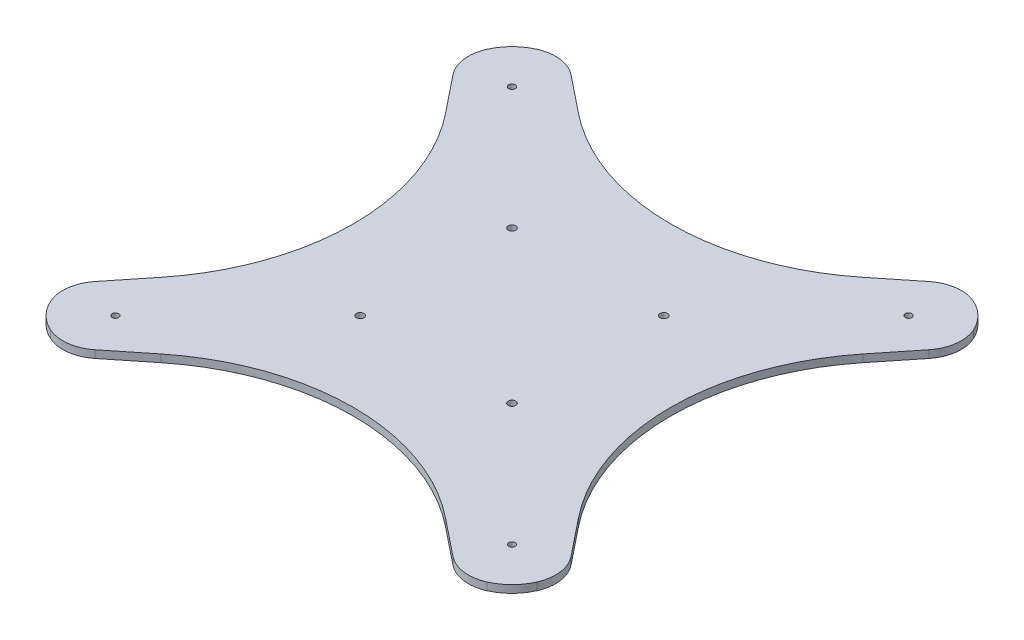
ISO-10303-21;
HEADER;
FILE_DESCRIPTION(('STEP AP214'),'2;1');
FILE_NAME('part.step','',(''),(''),'','','');
FILE_SCHEMA(('AUTOMOTIVE_DESIGN { 1 0 10303 214 1 1 1 1 }'));
ENDSEC;
DATA;
#1=APPLICATION_CONTEXT('core data for automotive mechanical design processes');
#2=APPLICATION_PROTOCOL_DEFINITION('international standard','automotive_design',2000,#1);
#3=PRODUCT_CONTEXT('',#1,'mechanical');
#4=PRODUCT('Part','Part','',(#3));
#5=PRODUCT_RELATED_PRODUCT_CATEGORY('part','',(#4));
#6=PRODUCT_DEFINITION_FORMATION('','',#4);
#7=PRODUCT_DEFINITION_CONTEXT('part definition',#1,'design');
#8=PRODUCT_DEFINITION('design','',#6,#7);
#9=PRODUCT_DEFINITION_SHAPE('','',#8);
#10=(LENGTH_UNIT() NAMED_UNIT(*) SI_UNIT(.MILLI.,.METRE.));
#11=(NAMED_UNIT(*) PLANE_ANGLE_UNIT() SI_UNIT($,.RADIAN.));
#12=(NAMED_UNIT(*) SI_UNIT($,.STERADIAN.) SOLID_ANGLE_UNIT());
#13=UNCERTAINTY_MEASURE_WITH_UNIT(LENGTH_MEASURE(1.E-05),#10,'distance_accuracy_value','');
#14=(GEOMETRIC_REPRESENTATION_CONTEXT(3) GLOBAL_UNCERTAINTY_ASSIGNED_CONTEXT((#13)) GLOBAL_UNIT_ASSIGNED_CONTEXT((#10,
#11,#12)) REPRESENTATION_CONTEXT('',''));
#15=CARTESIAN_POINT('',(0.,0.,0.));
#16=DIRECTION('',(0.,0.,1.));
#17=DIRECTION('',(1.,0.,0.));
#18=AXIS2_PLACEMENT_3D('',#15,#16,#17);
#19=CARTESIAN_POINT('',(109.89190371645,4.,106.880500832727));
#20=DIRECTION('',(0.,-1.,0.));
#21=DIRECTION('',(0.,0.,-1.));
#22=AXIS2_PLACEMENT_3D('',#19,#20,#21);
#23=CYLINDRICAL_SURFACE('',#22,20.);
#24=DIRECTION('',(0.,1.,0.));
#25=VECTOR('',#24,1.);
#26=CARTESIAN_POINT('',(125.50927990531,4.,94.386599881638));
#27=LINE('',#26,#25);
#28=CARTESIAN_POINT('',(125.50927990531,4.,94.3865998816379));
#29=VERTEX_POINT('',#28);
#30=CARTESIAN_POINT('',(125.50927990531,0.,94.3865998816379));
#31=VERTEX_POINT('',#30);
#32=EDGE_CURVE('E294',#29,#31,#27,.F.);
#33=ORIENTED_EDGE('',*,*,#32,.F.);
#34=CARTESIAN_POINT('',(109.89190371645,4.,106.880500832727));
#35=DIRECTION('',(0.,-1.,0.));
#36=DIRECTION('',(0.,0.,-1.));
#37=AXIS2_PLACEMENT_3D('',#34,#35,#36);
#38=CIRCLE('',#37,20.);
#39=CARTESIAN_POINT('',(128.188103990499,4.,114.958189582108));
#40=VERTEX_POINT('',#39);
#41=EDGE_CURVE('E42',#40,#29,#38,.F.);
#42=ORIENTED_EDGE('',*,*,#41,.F.);
#43=DIRECTION('',(0.,-1.,0.));
#44=VECTOR('',#43,1.);
#45=CARTESIAN_POINT('',(128.188103990499,4.,114.958189582108));
#46=LINE('',#45,#44);
#47=CARTESIAN_POINT('',(128.188103990499,0.,114.958189582108));
#48=VERTEX_POINT('',#47);
#49=EDGE_CURVE('E297',#48,#40,#46,.F.);
#50=ORIENTED_EDGE('',*,*,#49,.F.);
#51=CARTESIAN_POINT('',(109.89190371645,0.,106.880500832727));
#52=DIRECTION('',(0.,-1.,0.));
#53=DIRECTION('',(0.,0.,-1.));
#54=AXIS2_PLACEMENT_3D('',#51,#52,#53);
#55=CIRCLE('',#54,20.);
#56=EDGE_CURVE('E11',#31,#48,#55,.T.);
#57=ORIENTED_EDGE('',*,*,#56,.F.);
#58=EDGE_LOOP('',(#33,#42,#50,#57));
#59=FACE_BOUND('',#58,.T.);
#60=ADVANCED_FACE('F35',(#59),#23,.T.);
#61=CARTESIAN_POINT('',(106.880500832726,4.,109.89190371645));
#62=DIRECTION('',(0.,-1.,0.));
#63=DIRECTION('',(0.,0.,-1.));
#64=AXIS2_PLACEMENT_3D('',#61,#62,#63);
#65=CYLINDRICAL_SURFACE('',#64,20.);
#66=DIRECTION('',(0.,-1.,0.));
#67=VECTOR('',#66,1.);
#68=CARTESIAN_POINT('',(94.3865998816379,4.,125.509279905311));
#69=LINE('',#68,#67);
#70=CARTESIAN_POINT('',(94.3865998816379,0.,125.509279905311));
#71=VERTEX_POINT('',#70);
#72=CARTESIAN_POINT('',(94.3865998816379,4.,125.509279905311));
#73=VERTEX_POINT('',#72);
#74=EDGE_CURVE('E284',#71,#73,#69,.F.);
#75=ORIENTED_EDGE('',*,*,#74,.F.);
#76=CARTESIAN_POINT('',(106.880500832726,0.,109.89190371645));
#77=DIRECTION('',(0.,-1.,0.));
#78=DIRECTION('',(0.,0.,-1.));
#79=AXIS2_PLACEMENT_3D('',#76,#77,#78);
#80=CIRCLE('',#79,20.);
#81=CARTESIAN_POINT('',(114.958189582106,0.,128.1881039905));
#82=VERTEX_POINT('',#81);
#83=EDGE_CURVE('E290',#82,#71,#80,.T.);
#84=ORIENTED_EDGE('',*,*,#83,.F.);
#85=DIRECTION('',(0.,-1.,0.));
#86=VECTOR('',#85,1.);
#87=CARTESIAN_POINT('',(114.958189582106,4.,128.1881039905));
#88=LINE('',#87,#86);
#89=CARTESIAN_POINT('',(114.958189582106,4.,128.1881039905));
#90=VERTEX_POINT('',#89);
#91=EDGE_CURVE('E287',#90,#82,#88,.T.);
#92=ORIENTED_EDGE('',*,*,#91,.F.);
#93=CARTESIAN_POINT('',(106.880500832726,4.,109.89190371645));
#94=DIRECTION('',(0.,-1.,0.));
#95=DIRECTION('',(0.,0.,-1.));
#96=AXIS2_PLACEMENT_3D('',#93,#94,#95);
#97=CIRCLE('',#96,20.);
#98=EDGE_CURVE('E292',#73,#90,#97,.F.);
#99=ORIENTED_EDGE('',*,*,#98,.F.);
#100=EDGE_LOOP('',(#75,#84,#92,#99));
#101=FACE_BOUND('',#100,.T.);
#102=ADVANCED_FACE('F556',(#101),#65,.T.);
#103=CARTESIAN_POINT('',(-109.89190371645,4.,106.880500832727));
#104=DIRECTION('',(0.,-1.,0.));
#105=DIRECTION('',(0.,0.,-1.));
#106=AXIS2_PLACEMENT_3D('',#103,#104,#105);
#107=CYLINDRICAL_SURFACE('',#106,20.);
#108=DIRECTION('',(0.,-1.,0.));
#109=VECTOR('',#108,1.);
#110=CARTESIAN_POINT('',(-125.50927990531,4.,94.3865998816381));
#111=LINE('',#110,#109);
#112=CARTESIAN_POINT('',(-125.50927990531,0.,94.3865998816382));
#113=VERTEX_POINT('',#112);
#114=CARTESIAN_POINT('',(-125.50927990531,4.,94.3865998816382));
#115=VERTEX_POINT('',#114);
#116=EDGE_CURVE('E274',#113,#115,#111,.F.);
#117=ORIENTED_EDGE('',*,*,#116,.F.);
#118=CARTESIAN_POINT('',(-109.89190371645,0.,106.880500832727));
#119=DIRECTION('',(0.,-1.,0.));
#120=DIRECTION('',(0.,0.,-1.));
#121=AXIS2_PLACEMENT_3D('',#118,#119,#120);
#122=CIRCLE('',#121,20.);
#123=CARTESIAN_POINT('',(-128.188103990499,0.,114.958189582107));
#124=VERTEX_POINT('',#123);
#125=EDGE_CURVE('E280',#124,#113,#122,.T.);
#126=ORIENTED_EDGE('',*,*,#125,.F.);
#127=DIRECTION('',(0.,-1.,0.));
#128=VECTOR('',#127,1.);
#129=CARTESIAN_POINT('',(-128.188103990499,4.,114.958189582107));
#130=LINE('',#129,#128);
#131=CARTESIAN_POINT('',(-128.188103990499,4.,114.958189582107));
#132=VERTEX_POINT('',#131);
#133=EDGE_CURVE('E277',#132,#124,#130,.T.);
#134=ORIENTED_EDGE('',*,*,#133,.F.);
#135=CARTESIAN_POINT('',(-109.89190371645,4.,106.880500832727));
#136=DIRECTION('',(0.,-1.,0.));
#137=DIRECTION('',(0.,0.,-1.));
#138=AXIS2_PLACEMENT_3D('',#135,#136,#137);
#139=CIRCLE('',#138,20.);
#140=EDGE_CURVE('E282',#115,#132,#139,.F.);
#141=ORIENTED_EDGE('',*,*,#140,.F.);
#142=EDGE_LOOP('',(#117,#126,#134,#141));
#143=FACE_BOUND('',#142,.T.);
#144=ADVANCED_FACE('F455',(#143),#107,.T.);
#145=CARTESIAN_POINT('',(-106.880500832726,4.,109.89190371645));
#146=DIRECTION('',(0.,-1.,0.));
#147=DIRECTION('',(0.,0.,-1.));
#148=AXIS2_PLACEMENT_3D('',#145,#146,#147);
#149=CYLINDRICAL_SURFACE('',#148,20.);
#150=DIRECTION('',(0.,-1.,0.));
#151=VECTOR('',#150,1.);
#152=CARTESIAN_POINT('',(-94.3865998816377,4.,125.50927990531));
#153=LINE('',#152,#151);
#154=CARTESIAN_POINT('',(-94.3865998816377,4.,125.50927990531));
#155=VERTEX_POINT('',#154);
#156=CARTESIAN_POINT('',(-94.3865998816377,0.,125.50927990531));
#157=VERTEX_POINT('',#156);
#158=EDGE_CURVE('E265',#155,#157,#153,.T.);
#159=ORIENTED_EDGE('',*,*,#158,.F.);
#160=CARTESIAN_POINT('',(-106.880500832726,4.,109.89190371645));
#161=DIRECTION('',(0.,-1.,0.));
#162=DIRECTION('',(0.,0.,-1.));
#163=AXIS2_PLACEMENT_3D('',#160,#161,#162);
#164=CIRCLE('',#163,20.);
#165=CARTESIAN_POINT('',(-114.958189582106,4.,128.1881039905));
#166=VERTEX_POINT('',#165);
#167=EDGE_CURVE('E200',#166,#155,#164,.F.);
#168=ORIENTED_EDGE('',*,*,#167,.F.);
#169=DIRECTION('',(0.,-1.,0.));
#170=VECTOR('',#169,1.);
#171=CARTESIAN_POINT('',(-114.958189582106,4.,128.1881039905));
#172=LINE('',#171,#170);
#173=CARTESIAN_POINT('',(-114.958189582106,0.,128.1881039905));
#174=VERTEX_POINT('',#173);
#175=EDGE_CURVE('E267',#174,#166,#172,.F.);
#176=ORIENTED_EDGE('',*,*,#175,.F.);
#177=CARTESIAN_POINT('',(-106.880500832726,0.,109.89190371645));
#178=DIRECTION('',(0.,-1.,0.));
#179=DIRECTION('',(0.,0.,-1.));
#180=AXIS2_PLACEMENT_3D('',#177,#178,#179);
#181=CIRCLE('',#180,20.);
#182=EDGE_CURVE('E271',#157,#174,#181,.T.);
#183=ORIENTED_EDGE('',*,*,#182,.F.);
#184=EDGE_LOOP('',(#159,#168,#176,#183));
#185=FACE_BOUND('',#184,.T.);
#186=ADVANCED_FACE('F461',(#185),#149,.T.);
#187=CARTESIAN_POINT('',(-109.89190371645,4.,-106.880500832726));
#188=DIRECTION('',(0.,-1.,0.));
#189=DIRECTION('',(0.,0.,-1.));
#190=AXIS2_PLACEMENT_3D('',#187,#188,#189);
#191=CYLINDRICAL_SURFACE('',#190,20.);
#192=DIRECTION('',(0.,-1.,0.));
#193=VECTOR('',#192,1.);
#194=CARTESIAN_POINT('',(-125.50927990531,4.,-94.3865998816378));
#195=LINE('',#194,#193);
#196=CARTESIAN_POINT('',(-125.50927990531,4.,-94.3865998816378));
#197=VERTEX_POINT('',#196);
#198=CARTESIAN_POINT('',(-125.50927990531,0.,-94.3865998816378));
#199=VERTEX_POINT('',#198);
#200=EDGE_CURVE('E255',#197,#199,#195,.T.);
#201=ORIENTED_EDGE('',*,*,#200,.F.);
#202=CARTESIAN_POINT('',(-109.89190371645,4.,-106.880500832726));
#203=DIRECTION('',(0.,-1.,0.));
#204=DIRECTION('',(0.,0.,-1.));
#205=AXIS2_PLACEMENT_3D('',#202,#203,#204);
#206=CIRCLE('',#205,20.);
#207=CARTESIAN_POINT('',(-128.1881039905,4.,-114.958189582106));
#208=VERTEX_POINT('',#207);
#209=EDGE_CURVE('E261',#208,#197,#206,.F.);
#210=ORIENTED_EDGE('',*,*,#209,.F.);
#211=DIRECTION('',(0.,-1.,0.));
#212=VECTOR('',#211,1.);
#213=CARTESIAN_POINT('',(-128.1881039905,4.,-114.958189582106));
#214=LINE('',#213,#212);
#215=CARTESIAN_POINT('',(-128.1881039905,0.,-114.958189582106));
#216=VERTEX_POINT('',#215);
#217=EDGE_CURVE('E258',#216,#208,#214,.F.);
#218=ORIENTED_EDGE('',*,*,#217,.F.);
#219=CARTESIAN_POINT('',(-109.89190371645,0.,-106.880500832726));
#220=DIRECTION('',(0.,-1.,0.));
#221=DIRECTION('',(0.,0.,-1.));
#222=AXIS2_PLACEMENT_3D('',#219,#220,#221);
#223=CIRCLE('',#222,20.);
#224=EDGE_CURVE('E263',#199,#216,#223,.T.);
#225=ORIENTED_EDGE('',*,*,#224,.F.);
#226=EDGE_LOOP('',(#201,#210,#218,#225));
#227=FACE_BOUND('',#226,.T.);
#228=ADVANCED_FACE('F436',(#227),#191,.T.);
#229=CARTESIAN_POINT('',(-106.880500832726,4.,-109.89190371645));
#230=DIRECTION('',(0.,-1.,0.));
#231=DIRECTION('',(0.,0.,-1.));
#232=AXIS2_PLACEMENT_3D('',#229,#230,#231);
#233=CYLINDRICAL_SURFACE('',#232,20.);
#234=DIRECTION('',(0.,1.,0.));
#235=VECTOR('',#234,1.);
#236=CARTESIAN_POINT('',(-94.3865998816378,4.,-125.50927990531));
#237=LINE('',#236,#235);
#238=CARTESIAN_POINT('',(-94.3865998816378,0.,-125.50927990531));
#239=VERTEX_POINT('',#238);
#240=CARTESIAN_POINT('',(-94.3865998816378,4.,-125.50927990531));
#241=VERTEX_POINT('',#240);
#242=EDGE_CURVE('E245',#239,#241,#237,.T.);
#243=ORIENTED_EDGE('',*,*,#242,.F.);
#244=CARTESIAN_POINT('',(-106.880500832726,0.,-109.89190371645));
#245=DIRECTION('',(0.,-1.,0.));
#246=DIRECTION('',(0.,0.,-1.));
#247=AXIS2_PLACEMENT_3D('',#244,#245,#246);
#248=CIRCLE('',#247,20.);
#249=CARTESIAN_POINT('',(-114.958189582106,0.,-128.1881039905));
#250=VERTEX_POINT('',#249);
#251=EDGE_CURVE('E251',#250,#239,#248,.T.);
#252=ORIENTED_EDGE('',*,*,#251,.F.);
#253=DIRECTION('',(0.,-1.,0.));
#254=VECTOR('',#253,1.);
#255=CARTESIAN_POINT('',(-114.958189582106,4.,-128.1881039905));
#256=LINE('',#255,#254);
#257=CARTESIAN_POINT('',(-114.958189582106,4.,-128.1881039905));
#258=VERTEX_POINT('',#257);
#259=EDGE_CURVE('E248',#258,#250,#256,.T.);
#260=ORIENTED_EDGE('',*,*,#259,.F.);
#261=CARTESIAN_POINT('',(-106.880500832726,4.,-109.89190371645));
#262=DIRECTION('',(0.,-1.,0.));
#263=DIRECTION('',(0.,0.,-1.));
#264=AXIS2_PLACEMENT_3D('',#261,#262,#263);
#265=CIRCLE('',#264,20.);
#266=EDGE_CURVE('E253',#241,#258,#265,.F.);
#267=ORIENTED_EDGE('',*,*,#266,.F.);
#268=EDGE_LOOP('',(#243,#252,#260,#267));
#269=FACE_BOUND('',#268,.T.);
#270=ADVANCED_FACE('F429',(#269),#233,.T.);
#271=CARTESIAN_POINT('',(106.880500832726,4.,-109.89190371645));
#272=DIRECTION('',(0.,-1.,0.));
#273=DIRECTION('',(0.,0.,-1.));
#274=AXIS2_PLACEMENT_3D('',#271,#272,#273);
#275=CYLINDRICAL_SURFACE('',#274,20.);
#276=DIRECTION('',(0.,1.,0.));
#277=VECTOR('',#276,1.);
#278=CARTESIAN_POINT('',(94.3865998816378,4.,-125.50927990531));
#279=LINE('',#278,#277);
#280=CARTESIAN_POINT('',(94.3865998816378,4.,-125.50927990531));
#281=VERTEX_POINT('',#280);
#282=CARTESIAN_POINT('',(94.3865998816378,0.,-125.50927990531));
#283=VERTEX_POINT('',#282);
#284=EDGE_CURVE('E235',#281,#283,#279,.F.);
#285=ORIENTED_EDGE('',*,*,#284,.F.);
#286=CARTESIAN_POINT('',(106.880500832726,4.,-109.89190371645));
#287=DIRECTION('',(0.,-1.,0.));
#288=DIRECTION('',(0.,0.,-1.));
#289=AXIS2_PLACEMENT_3D('',#286,#287,#288);
#290=CIRCLE('',#289,20.);
#291=CARTESIAN_POINT('',(114.958189582106,4.,-128.1881039905));
#292=VERTEX_POINT('',#291);
#293=EDGE_CURVE('E241',#292,#281,#290,.F.);
#294=ORIENTED_EDGE('',*,*,#293,.F.);
#295=DIRECTION('',(0.,-1.,0.));
#296=VECTOR('',#295,1.);
#297=CARTESIAN_POINT('',(114.958189582106,4.,-128.1881039905));
#298=LINE('',#297,#296);
#299=CARTESIAN_POINT('',(114.958189582106,0.,-128.1881039905));
#300=VERTEX_POINT('',#299);
#301=EDGE_CURVE('E238',#300,#292,#298,.F.);
#302=ORIENTED_EDGE('',*,*,#301,.F.);
#303=CARTESIAN_POINT('',(106.880500832726,0.,-109.89190371645));
#304=DIRECTION('',(0.,-1.,0.));
#305=DIRECTION('',(0.,0.,-1.));
#306=AXIS2_PLACEMENT_3D('',#303,#304,#305);
#307=CIRCLE('',#306,20.);
#308=EDGE_CURVE('E243',#283,#300,#307,.T.);
#309=ORIENTED_EDGE('',*,*,#308,.F.);
#310=EDGE_LOOP('',(#285,#294,#302,#309));
#311=FACE_BOUND('',#310,.T.);
#312=ADVANCED_FACE('F411',(#311),#275,.T.);
#313=CARTESIAN_POINT('',(109.89190371645,4.,-106.880500832726));
#314=DIRECTION('',(0.,-1.,0.));
#315=DIRECTION('',(0.,0.,-1.));
#316=AXIS2_PLACEMENT_3D('',#313,#314,#315);
#317=CYLINDRICAL_SURFACE('',#316,20.);
#318=DIRECTION('',(0.,1.,0.));
#319=VECTOR('',#318,1.);
#320=CARTESIAN_POINT('',(125.50927990531,4.,-94.3865998816377));
#321=LINE('',#320,#319);
#322=CARTESIAN_POINT('',(125.50927990531,0.,-94.3865998816378));
#323=VERTEX_POINT('',#322);
#324=CARTESIAN_POINT('',(125.50927990531,4.,-94.3865998816378));
#325=VERTEX_POINT('',#324);
#326=EDGE_CURVE('E220',#323,#325,#321,.T.);
#327=ORIENTED_EDGE('',*,*,#326,.F.);
#328=CARTESIAN_POINT('',(109.89190371645,0.,-106.880500832726));
#329=DIRECTION('',(0.,-1.,0.));
#330=DIRECTION('',(0.,0.,-1.));
#331=AXIS2_PLACEMENT_3D('',#328,#329,#330);
#332=CIRCLE('',#331,20.);
#333=CARTESIAN_POINT('',(128.1881039905,0.,-114.958189582106));
#334=VERTEX_POINT('',#333);
#335=EDGE_CURVE('E231',#334,#323,#332,.T.);
#336=ORIENTED_EDGE('',*,*,#335,.F.);
#337=DIRECTION('',(0.,-1.,0.));
#338=VECTOR('',#337,1.);
#339=CARTESIAN_POINT('',(128.1881039905,4.,-114.958189582106));
#340=LINE('',#339,#338);
#341=CARTESIAN_POINT('',(128.1881039905,4.,-114.958189582106));
#342=VERTEX_POINT('',#341);
#343=EDGE_CURVE('E223',#342,#334,#340,.T.);
#344=ORIENTED_EDGE('',*,*,#343,.F.);
#345=CARTESIAN_POINT('',(109.89190371645,4.,-106.880500832726));
#346=DIRECTION('',(0.,-1.,0.));
#347=DIRECTION('',(0.,0.,-1.));
#348=AXIS2_PLACEMENT_3D('',#345,#346,#347);
#349=CIRCLE('',#348,20.);
#350=EDGE_CURVE('E233',#325,#342,#349,.F.);
#351=ORIENTED_EDGE('',*,*,#350,.F.);
#352=EDGE_LOOP('',(#327,#336,#344,#351));
#353=FACE_BOUND('',#352,.T.);
#354=ADVANCED_FACE('F405',(#353),#317,.T.);
#355=CARTESIAN_POINT('',(-99.9999999999998,4.,130.));
#356=DIRECTION('',(-0.624695047554429,0.,-0.780868809443027));
#357=DIRECTION('',(-0.780868809443027,0.,0.624695047554429));
#358=AXIS2_PLACEMENT_3D('',#355,#356,#357);
#359=PLANE('',#358);
#360=DIRECTION('',(0.780868809443027,0.,-0.624695047554429));
#361=VECTOR('',#360,1.);
#362=CARTESIAN_POINT('',(-99.9999999999998,4.,130.));
#363=LINE('',#362,#361);
#364=CARTESIAN_POINT('',(-74.9634057065314,4.,109.970724565225));
#365=VERTEX_POINT('',#364);
#366=EDGE_CURVE('E192',#155,#365,#363,.T.);
#367=ORIENTED_EDGE('',*,*,#366,.F.);
#368=ORIENTED_EDGE('',*,*,#158,.T.);
#369=DIRECTION('',(0.780868809443027,0.,-0.624695047554429));
#370=VECTOR('',#369,1.);
#371=CARTESIAN_POINT('',(-99.9999999999998,0.,130.));
#372=LINE('',#371,#370);
#373=CARTESIAN_POINT('',(-74.9634057065314,0.,109.970724565225));
#374=VERTEX_POINT('',#373);
#375=EDGE_CURVE('E218',#157,#374,#372,.T.);
#376=ORIENTED_EDGE('',*,*,#375,.T.);
#377=DIRECTION('',(0.,-1.,0.));
#378=VECTOR('',#377,1.);
#379=CARTESIAN_POINT('',(-74.9634057065314,4.,109.970724565225));
#380=LINE('',#379,#378);
#381=EDGE_CURVE('E210',#365,#374,#380,.T.);
#382=ORIENTED_EDGE('',*,*,#381,.F.);
#383=EDGE_LOOP('',(#367,#368,#376,#382));
#384=FACE_BOUND('',#383,.T.);
#385=ADVANCED_FACE('F216',(#384),#359,.F.);
#386=CARTESIAN_POINT('',(0.,4.,203.674981698388));
#387=DIRECTION('',(0.,-1.,0.));
#388=DIRECTION('',(0.,0.,-1.));
#389=AXIS2_PLACEMENT_3D('',#386,#387,#388);
#390=CYLINDRICAL_SURFACE('',#389,120.);
#391=CARTESIAN_POINT('',(0.,0.,203.674981698388));
#392=DIRECTION('',(0.,-1.,0.));
#393=DIRECTION('',(0.,0.,-1.));
#394=AXIS2_PLACEMENT_3D('',#391,#392,#393);
#395=CIRCLE('',#394,120.);
#396=CARTESIAN_POINT('',(74.9634057065294,0.,109.970724565224));
#397=VERTEX_POINT('',#396);
#398=EDGE_CURVE('E341',#374,#397,#395,.T.);
#399=ORIENTED_EDGE('',*,*,#398,.T.);
#400=DIRECTION('',(0.,-1.,0.));
#401=VECTOR('',#400,1.);
#402=CARTESIAN_POINT('',(74.9634057065294,4.,109.970724565224));
#403=LINE('',#402,#401);
#404=CARTESIAN_POINT('',(74.9634057065294,4.,109.970724565224));
#405=VERTEX_POINT('',#404);
#406=EDGE_CURVE('E212',#405,#397,#403,.T.);
#407=ORIENTED_EDGE('',*,*,#406,.F.);
#408=CARTESIAN_POINT('',(0.,4.,203.674981698388));
#409=DIRECTION('',(0.,-1.,0.));
#410=DIRECTION('',(0.,0.,-1.));
#411=AXIS2_PLACEMENT_3D('',#408,#409,#410);
#412=CIRCLE('',#411,120.);
#413=EDGE_CURVE('E197',#365,#405,#412,.T.);
#414=ORIENTED_EDGE('',*,*,#413,.F.);
#415=ORIENTED_EDGE('',*,*,#381,.T.);
#416=EDGE_LOOP('',(#399,#407,#414,#415));
#417=FACE_BOUND('',#416,.T.);
#418=ADVANCED_FACE('F209',(#417),#390,.F.);
#419=CARTESIAN_POINT('',(74.9634057065294,4.,109.970724565224));
#420=DIRECTION('',(0.624695047554432,0.,-0.780868809443024));
#421=DIRECTION('',(-0.780868809443024,0.,-0.624695047554432));
#422=AXIS2_PLACEMENT_3D('',#419,#420,#421);
#423=PLANE('',#422);
#424=DIRECTION('',(0.780868809443024,0.,0.624695047554432));
#425=VECTOR('',#424,1.);
#426=CARTESIAN_POINT('',(74.9634057065294,0.,109.970724565224));
#427=LINE('',#426,#425);
#428=EDGE_CURVE('E344',#397,#71,#427,.T.);
#429=ORIENTED_EDGE('',*,*,#428,.T.);
#430=ORIENTED_EDGE('',*,*,#74,.T.);
#431=DIRECTION('',(0.780868809443024,0.,0.624695047554432));
#432=VECTOR('',#431,1.);
#433=CARTESIAN_POINT('',(74.9634057065294,4.,109.970724565224));
#434=LINE('',#433,#432);
#435=EDGE_CURVE('E214',#405,#73,#434,.T.);
#436=ORIENTED_EDGE('',*,*,#435,.F.);
#437=ORIENTED_EDGE('',*,*,#406,.T.);
#438=EDGE_LOOP('',(#429,#430,#436,#437));
#439=FACE_BOUND('',#438,.T.);
#440=ADVANCED_FACE('F464',(#439),#423,.F.);
#441=CARTESIAN_POINT('',(104.5,4.,104.5));
#442=DIRECTION('',(0.,-1.,0.));
#443=DIRECTION('',(0.,0.,-1.));
#444=AXIS2_PLACEMENT_3D('',#441,#442,#443);
#445=CYLINDRICAL_SURFACE('',#444,25.8940147524486);
#446=CARTESIAN_POINT('',(104.5,0.,104.5));
#447=DIRECTION('',(0.,1.,0.));
#448=DIRECTION('',(0.,0.,1.));
#449=AXIS2_PLACEMENT_3D('',#446,#447,#448);
#450=CIRCLE('',#449,25.8940147524486);
#451=EDGE_CURVE('E347',#82,#48,#450,.T.);
#452=ORIENTED_EDGE('',*,*,#451,.T.);
#453=ORIENTED_EDGE('',*,*,#49,.T.);
#454=CARTESIAN_POINT('',(104.5,4.,104.5));
#455=DIRECTION('',(0.,1.,0.));
#456=DIRECTION('',(0.,0.,1.));
#457=AXIS2_PLACEMENT_3D('',#454,#455,#456);
#458=CIRCLE('',#457,25.8940147524486);
#459=EDGE_CURVE('E304',#90,#40,#458,.T.);
#460=ORIENTED_EDGE('',*,*,#459,.F.);
#461=ORIENTED_EDGE('',*,*,#91,.T.);
#462=EDGE_LOOP('',(#452,#453,#460,#461));
#463=FACE_BOUND('',#462,.T.);
#464=ADVANCED_FACE('F582',(#463),#445,.T.);
#465=CARTESIAN_POINT('',(109.970724565227,4.,74.9634057065347));
#466=DIRECTION('',(0.780868809443008,0.,-0.624695047554452));
#467=DIRECTION('',(-0.624695047554452,0.,-0.780868809443008));
#468=AXIS2_PLACEMENT_3D('',#465,#466,#467);
#469=PLANE('',#468);
#470=DIRECTION('',(0.624695047554452,0.,0.780868809443008));
#471=VECTOR('',#470,1.);
#472=CARTESIAN_POINT('',(109.970724565227,4.,74.9634057065347));
#473=LINE('',#472,#471);
#474=CARTESIAN_POINT('',(109.970724565227,4.,74.9634057065347));
#475=VERTEX_POINT('',#474);
#476=EDGE_CURVE('E301',#475,#29,#473,.T.);
#477=ORIENTED_EDGE('',*,*,#476,.T.);
#478=ORIENTED_EDGE('',*,*,#32,.T.);
#479=DIRECTION('',(0.624695047554452,0.,0.780868809443008));
#480=VECTOR('',#479,1.);
#481=CARTESIAN_POINT('',(109.970724565227,0.,74.9634057065347));
#482=LINE('',#481,#480);
#483=CARTESIAN_POINT('',(109.970724565227,0.,74.9634057065347));
#484=VERTEX_POINT('',#483);
#485=EDGE_CURVE('E350',#484,#31,#482,.T.);
#486=ORIENTED_EDGE('',*,*,#485,.F.);
#487=DIRECTION('',(0.,-1.,0.));
#488=VECTOR('',#487,1.);
#489=CARTESIAN_POINT('',(109.970724565227,4.,74.9634057065347));
#490=LINE('',#489,#488);
#491=EDGE_CURVE('E225',#475,#484,#490,.T.);
#492=ORIENTED_EDGE('',*,*,#491,.F.);
#493=EDGE_LOOP('',(#477,#478,#486,#492));
#494=FACE_BOUND('',#493,.T.);
#495=ADVANCED_FACE('F307',(#494),#469,.T.);
#496=CARTESIAN_POINT('',(203.674981698388,4.,0.));
#497=DIRECTION('',(0.,-1.,0.));
#498=DIRECTION('',(0.,0.,-1.));
#499=AXIS2_PLACEMENT_3D('',#496,#497,#498);
#500=CYLINDRICAL_SURFACE('',#499,120.000000000001);
#501=CARTESIAN_POINT('',(203.674981698388,0.,0.));
#502=DIRECTION('',(0.,1.,0.));
#503=DIRECTION('',(0.,0.,1.));
#504=AXIS2_PLACEMENT_3D('',#501,#502,#503);
#505=CIRCLE('',#504,120.000000000001);
#506=CARTESIAN_POINT('',(109.970724565224,0.,-74.9634057065315));
#507=VERTEX_POINT('',#506);
#508=EDGE_CURVE('E352',#507,#484,#505,.T.);
#509=ORIENTED_EDGE('',*,*,#508,.F.);
#510=DIRECTION('',(0.,-1.,0.));
#511=VECTOR('',#510,1.);
#512=CARTESIAN_POINT('',(109.970724565224,4.,-74.9634057065315));
#513=LINE('',#512,#511);
#514=CARTESIAN_POINT('',(109.970724565224,4.,-74.9634057065315));
#515=VERTEX_POINT('',#514);
#516=EDGE_CURVE('E389',#515,#507,#513,.T.);
#517=ORIENTED_EDGE('',*,*,#516,.F.);
#518=CARTESIAN_POINT('',(203.674981698388,4.,0.));
#519=DIRECTION('',(0.,1.,0.));
#520=DIRECTION('',(0.,0.,1.));
#521=AXIS2_PLACEMENT_3D('',#518,#519,#520);
#522=CIRCLE('',#521,120.000000000001);
#523=EDGE_CURVE('E308',#515,#475,#522,.T.);
#524=ORIENTED_EDGE('',*,*,#523,.T.);
#525=ORIENTED_EDGE('',*,*,#491,.T.);
#526=EDGE_LOOP('',(#509,#517,#524,#525));
#527=FACE_BOUND('',#526,.T.);
#528=ADVANCED_FACE('F393',(#527),#500,.F.);
#529=CARTESIAN_POINT('',(130.,4.,-99.9999999999998));
#530=DIRECTION('',(0.780868809443024,0.,0.624695047554432));
#531=DIRECTION('',(0.624695047554432,0.,-0.780868809443024));
#532=AXIS2_PLACEMENT_3D('',#529,#530,#531);
#533=PLANE('',#532);
#534=DIRECTION('',(-0.624695047554432,0.,0.780868809443024));
#535=VECTOR('',#534,1.);
#536=CARTESIAN_POINT('',(130.,0.,-99.9999999999998));
#537=LINE('',#536,#535);
#538=EDGE_CURVE('E355',#323,#507,#537,.T.);
#539=ORIENTED_EDGE('',*,*,#538,.F.);
#540=ORIENTED_EDGE('',*,*,#326,.T.);
#541=DIRECTION('',(-0.624695047554432,0.,0.780868809443024));
#542=VECTOR('',#541,1.);
#543=CARTESIAN_POINT('',(130.,4.,-99.9999999999998));
#544=LINE('',#543,#542);
#545=EDGE_CURVE('E310',#325,#515,#544,.T.);
#546=ORIENTED_EDGE('',*,*,#545,.T.);
#547=ORIENTED_EDGE('',*,*,#516,.T.);
#548=EDGE_LOOP('',(#539,#540,#546,#547));
#549=FACE_BOUND('',#548,.T.);
#550=ADVANCED_FACE('F400',(#549),#533,.T.);
#551=CARTESIAN_POINT('',(104.5,4.,-104.5));
#552=DIRECTION('',(0.,-1.,0.));
#553=DIRECTION('',(0.,0.,-1.));
#554=AXIS2_PLACEMENT_3D('',#551,#552,#553);
#555=CYLINDRICAL_SURFACE('',#554,25.8940147524482);
#556=CARTESIAN_POINT('',(104.5,0.,-104.5));
#557=DIRECTION('',(0.,1.,0.));
#558=DIRECTION('',(0.,0.,1.));
#559=AXIS2_PLACEMENT_3D('',#556,#557,#558);
#560=CIRCLE('',#559,25.8940147524482);
#561=EDGE_CURVE('E357',#334,#300,#560,.T.);
#562=ORIENTED_EDGE('',*,*,#561,.T.);
#563=ORIENTED_EDGE('',*,*,#301,.T.);
#564=CARTESIAN_POINT('',(104.5,4.,-104.5));
#565=DIRECTION('',(0.,1.,0.));
#566=DIRECTION('',(0.,0.,1.));
#567=AXIS2_PLACEMENT_3D('',#564,#565,#566);
#568=CIRCLE('',#567,25.8940147524482);
#569=EDGE_CURVE('E316',#342,#292,#568,.T.);
#570=ORIENTED_EDGE('',*,*,#569,.F.);
#571=ORIENTED_EDGE('',*,*,#343,.T.);
#572=EDGE_LOOP('',(#562,#563,#570,#571));
#573=FACE_BOUND('',#572,.T.);
#574=ADVANCED_FACE('F407',(#573),#555,.T.);
#575=CARTESIAN_POINT('',(74.9634057065315,4.,-109.970724565225));
#576=DIRECTION('',(-0.624695047554425,0.,-0.78086880944303));
#577=DIRECTION('',(-0.78086880944303,0.,0.624695047554425));
#578=AXIS2_PLACEMENT_3D('',#575,#576,#577);
#579=PLANE('',#578);
#580=DIRECTION('',(0.78086880944303,0.,-0.624695047554425));
#581=VECTOR('',#580,1.);
#582=CARTESIAN_POINT('',(74.9634057065315,4.,-109.970724565225));
#583=LINE('',#582,#581);
#584=CARTESIAN_POINT('',(74.9634057065315,4.,-109.970724565225));
#585=VERTEX_POINT('',#584);
#586=EDGE_CURVE('E319',#585,#281,#583,.T.);
#587=ORIENTED_EDGE('',*,*,#586,.T.);
#588=ORIENTED_EDGE('',*,*,#284,.T.);
#589=DIRECTION('',(0.78086880944303,0.,-0.624695047554425));
#590=VECTOR('',#589,1.);
#591=CARTESIAN_POINT('',(74.9634057065315,0.,-109.970724565225));
#592=LINE('',#591,#590);
#593=CARTESIAN_POINT('',(74.9634057065315,0.,-109.970724565225));
#594=VERTEX_POINT('',#593);
#595=EDGE_CURVE('E360',#594,#283,#592,.T.);
#596=ORIENTED_EDGE('',*,*,#595,.F.);
#597=DIRECTION('',(0.,-1.,0.));
#598=VECTOR('',#597,1.);
#599=CARTESIAN_POINT('',(74.9634057065315,4.,-109.970724565225));
#600=LINE('',#599,#598);
#601=EDGE_CURVE('E387',#585,#594,#600,.T.);
#602=ORIENTED_EDGE('',*,*,#601,.F.);
#603=EDGE_LOOP('',(#587,#588,#596,#602));
#604=FACE_BOUND('',#603,.T.);
#605=ADVANCED_FACE('F417',(#604),#579,.T.);
#606=CARTESIAN_POINT('',(0.,4.,-203.674981698388));
#607=DIRECTION('',(0.,-1.,0.));
#608=DIRECTION('',(0.,0.,-1.));
#609=AXIS2_PLACEMENT_3D('',#606,#607,#608);
#610=CYLINDRICAL_SURFACE('',#609,120.);
#611=CARTESIAN_POINT('',(0.,0.,-203.674981698388));
#612=DIRECTION('',(0.,-1.,0.));
#613=DIRECTION('',(0.,0.,-1.));
#614=AXIS2_PLACEMENT_3D('',#611,#612,#613);
#615=CIRCLE('',#614,120.);
#616=CARTESIAN_POINT('',(-74.9634057065315,0.,-109.970724565225));
#617=VERTEX_POINT('',#616);
#618=EDGE_CURVE('E363',#594,#617,#615,.T.);
#619=ORIENTED_EDGE('',*,*,#618,.T.);
#620=DIRECTION('',(0.,-1.,0.));
#621=VECTOR('',#620,1.);
#622=CARTESIAN_POINT('',(-74.9634057065315,4.,-109.970724565225));
#623=LINE('',#622,#621);
#624=CARTESIAN_POINT('',(-74.9634057065315,4.,-109.970724565225));
#625=VERTEX_POINT('',#624);
#626=EDGE_CURVE('E384',#625,#617,#623,.T.);
#627=ORIENTED_EDGE('',*,*,#626,.F.);
#628=CARTESIAN_POINT('',(0.,4.,-203.674981698388));
#629=DIRECTION('',(0.,-1.,0.));
#630=DIRECTION('',(0.,0.,-1.));
#631=AXIS2_PLACEMENT_3D('',#628,#629,#630);
#632=CIRCLE('',#631,120.);
#633=EDGE_CURVE('E322',#585,#625,#632,.T.);
#634=ORIENTED_EDGE('',*,*,#633,.F.);
#635=ORIENTED_EDGE('',*,*,#601,.T.);
#636=EDGE_LOOP('',(#619,#627,#634,#635));
#637=FACE_BOUND('',#636,.T.);
#638=ADVANCED_FACE('F421',(#637),#610,.F.);
#639=CARTESIAN_POINT('',(-99.9999999999998,4.,-130.));
#640=DIRECTION('',(0.624695047554425,0.,-0.78086880944303));
#641=DIRECTION('',(-0.78086880944303,0.,-0.624695047554425));
#642=AXIS2_PLACEMENT_3D('',#639,#640,#641);
#643=PLANE('',#642);
#644=DIRECTION('',(0.78086880944303,0.,0.624695047554425));
#645=VECTOR('',#644,1.);
#646=CARTESIAN_POINT('',(-99.9999999999998,0.,-130.));
#647=LINE('',#646,#645);
#648=EDGE_CURVE('E366',#239,#617,#647,.T.);
#649=ORIENTED_EDGE('',*,*,#648,.F.);
#650=ORIENTED_EDGE('',*,*,#242,.T.);
#651=DIRECTION('',(0.78086880944303,0.,0.624695047554425));
#652=VECTOR('',#651,1.);
#653=CARTESIAN_POINT('',(-99.9999999999998,4.,-130.));
#654=LINE('',#653,#652);
#655=EDGE_CURVE('E325',#241,#625,#654,.T.);
#656=ORIENTED_EDGE('',*,*,#655,.T.);
#657=ORIENTED_EDGE('',*,*,#626,.T.);
#658=EDGE_LOOP('',(#649,#650,#656,#657));
#659=FACE_BOUND('',#658,.T.);
#660=ADVANCED_FACE('F424',(#659),#643,.T.);
#661=CARTESIAN_POINT('',(-104.5,4.,-104.5));
#662=DIRECTION('',(0.,-1.,0.));
#663=DIRECTION('',(0.,0.,-1.));
#664=AXIS2_PLACEMENT_3D('',#661,#662,#663);
#665=CYLINDRICAL_SURFACE('',#664,25.8940147524481);
#666=CARTESIAN_POINT('',(-104.5,0.,-104.5));
#667=DIRECTION('',(0.,1.,0.));
#668=DIRECTION('',(0.,0.,1.));
#669=AXIS2_PLACEMENT_3D('',#666,#667,#668);
#670=CIRCLE('',#669,25.8940147524481);
#671=EDGE_CURVE('E368',#250,#216,#670,.T.);
#672=ORIENTED_EDGE('',*,*,#671,.T.);
#673=ORIENTED_EDGE('',*,*,#217,.T.);
#674=CARTESIAN_POINT('',(-104.5,4.,-104.5));
#675=DIRECTION('',(0.,1.,0.));
#676=DIRECTION('',(0.,0.,1.));
#677=AXIS2_PLACEMENT_3D('',#674,#675,#676);
#678=CIRCLE('',#677,25.8940147524481);
#679=EDGE_CURVE('E327',#258,#208,#678,.T.);
#680=ORIENTED_EDGE('',*,*,#679,.F.);
#681=ORIENTED_EDGE('',*,*,#259,.T.);
#682=EDGE_LOOP('',(#672,#673,#680,#681));
#683=FACE_BOUND('',#682,.T.);
#684=ADVANCED_FACE('F432',(#683),#665,.T.);
#685=CARTESIAN_POINT('',(-130.,4.,-99.9999999999998));
#686=DIRECTION('',(0.78086880944303,0.,-0.624695047554424));
#687=DIRECTION('',(-0.624695047554424,0.,-0.78086880944303));
#688=AXIS2_PLACEMENT_3D('',#685,#686,#687);
#689=PLANE('',#688);
#690=DIRECTION('',(0.624695047554424,0.,0.78086880944303));
#691=VECTOR('',#690,1.);
#692=CARTESIAN_POINT('',(-130.,4.,-99.9999999999998));
#693=LINE('',#692,#691);
#694=CARTESIAN_POINT('',(-109.970724565225,4.,-74.9634057065308));
#695=VERTEX_POINT('',#694);
#696=EDGE_CURVE('E330',#197,#695,#693,.T.);
#697=ORIENTED_EDGE('',*,*,#696,.F.);
#698=ORIENTED_EDGE('',*,*,#200,.T.);
#699=DIRECTION('',(0.624695047554424,0.,0.78086880944303));
#700=VECTOR('',#699,1.);
#701=CARTESIAN_POINT('',(-130.,0.,-99.9999999999998));
#702=LINE('',#701,#700);
#703=CARTESIAN_POINT('',(-109.970724565225,0.,-74.9634057065308));
#704=VERTEX_POINT('',#703);
#705=EDGE_CURVE('E371',#199,#704,#702,.T.);
#706=ORIENTED_EDGE('',*,*,#705,.T.);
#707=DIRECTION('',(0.,-1.,0.));
#708=VECTOR('',#707,1.);
#709=CARTESIAN_POINT('',(-109.970724565225,4.,-74.9634057065308));
#710=LINE('',#709,#708);
#711=EDGE_CURVE('E381',#695,#704,#710,.T.);
#712=ORIENTED_EDGE('',*,*,#711,.F.);
#713=EDGE_LOOP('',(#697,#698,#706,#712));
#714=FACE_BOUND('',#713,.T.);
#715=ADVANCED_FACE('F442',(#714),#689,.F.);
#716=CARTESIAN_POINT('',(-203.674981698388,4.,1.57152069135691E-13));
#717=DIRECTION('',(0.,-1.,0.));
#718=DIRECTION('',(0.,0.,-1.));
#719=AXIS2_PLACEMENT_3D('',#716,#717,#718);
#720=CYLINDRICAL_SURFACE('',#719,120.);
#721=CARTESIAN_POINT('',(-203.674981698388,0.,1.57152069135691E-13));
#722=DIRECTION('',(0.,-1.,0.));
#723=DIRECTION('',(0.,0.,-1.));
#724=AXIS2_PLACEMENT_3D('',#721,#722,#723);
#725=CIRCLE('',#724,120.);
#726=CARTESIAN_POINT('',(-109.970724565225,0.,74.9634057065315));
#727=VERTEX_POINT('',#726);
#728=EDGE_CURVE('E373',#704,#727,#725,.T.);
#729=ORIENTED_EDGE('',*,*,#728,.T.);
#730=DIRECTION('',(0.,-1.,0.));
#731=VECTOR('',#730,1.);
#732=CARTESIAN_POINT('',(-109.970724565225,4.,74.9634057065315));
#733=LINE('',#732,#731);
#734=CARTESIAN_POINT('',(-109.970724565225,4.,74.9634057065315));
#735=VERTEX_POINT('',#734);
#736=EDGE_CURVE('E339',#735,#727,#733,.T.);
#737=ORIENTED_EDGE('',*,*,#736,.F.);
#738=CARTESIAN_POINT('',(-203.674981698388,4.,1.57152069135691E-13));
#739=DIRECTION('',(0.,-1.,0.));
#740=DIRECTION('',(0.,0.,-1.));
#741=AXIS2_PLACEMENT_3D('',#738,#739,#740);
#742=CIRCLE('',#741,120.);
#743=EDGE_CURVE('E332',#695,#735,#742,.T.);
#744=ORIENTED_EDGE('',*,*,#743,.F.);
#745=ORIENTED_EDGE('',*,*,#711,.T.);
#746=EDGE_LOOP('',(#729,#737,#744,#745));
#747=FACE_BOUND('',#746,.T.);
#748=ADVANCED_FACE('F446',(#747),#720,.F.);
#749=CARTESIAN_POINT('',(-109.970724565225,4.,74.9634057065315));
#750=DIRECTION('',(0.780868809443034,0.,0.62469504755442));
#751=DIRECTION('',(0.62469504755442,0.,-0.780868809443034));
#752=AXIS2_PLACEMENT_3D('',#749,#750,#751);
#753=PLANE('',#752);
#754=DIRECTION('',(-0.62469504755442,0.,0.780868809443034));
#755=VECTOR('',#754,1.);
#756=CARTESIAN_POINT('',(-109.970724565225,0.,74.9634057065315));
#757=LINE('',#756,#755);
#758=EDGE_CURVE('E375',#727,#113,#757,.T.);
#759=ORIENTED_EDGE('',*,*,#758,.T.);
#760=ORIENTED_EDGE('',*,*,#116,.T.);
#761=DIRECTION('',(-0.62469504755442,0.,0.780868809443034));
#762=VECTOR('',#761,1.);
#763=CARTESIAN_POINT('',(-109.970724565225,4.,74.9634057065315));
#764=LINE('',#763,#762);
#765=EDGE_CURVE('E334',#735,#115,#764,.T.);
#766=ORIENTED_EDGE('',*,*,#765,.F.);
#767=ORIENTED_EDGE('',*,*,#736,.T.);
#768=EDGE_LOOP('',(#759,#760,#766,#767));
#769=FACE_BOUND('',#768,.T.);
#770=ADVANCED_FACE('F450',(#769),#753,.F.);
#771=CARTESIAN_POINT('',(-104.5,4.,104.5));
#772=DIRECTION('',(0.,-1.,0.));
#773=DIRECTION('',(0.,0.,-1.));
#774=AXIS2_PLACEMENT_3D('',#771,#772,#773);
#775=CYLINDRICAL_SURFACE('',#774,25.8940147524481);
#776=CARTESIAN_POINT('',(-104.5,4.,104.5));
#777=DIRECTION('',(0.,1.,0.));
#778=DIRECTION('',(0.,0.,1.));
#779=AXIS2_PLACEMENT_3D('',#776,#777,#778);
#780=CIRCLE('',#779,25.8940147524481);
#781=EDGE_CURVE('E337',#132,#166,#780,.T.);
#782=ORIENTED_EDGE('',*,*,#781,.F.);
#783=ORIENTED_EDGE('',*,*,#133,.T.);
#784=CARTESIAN_POINT('',(-104.5,0.,104.5));
#785=DIRECTION('',(0.,1.,0.));
#786=DIRECTION('',(0.,0.,1.));
#787=AXIS2_PLACEMENT_3D('',#784,#785,#786);
#788=CIRCLE('',#787,25.8940147524481);
#789=EDGE_CURVE('E205',#124,#174,#788,.T.);
#790=ORIENTED_EDGE('',*,*,#789,.T.);
#791=ORIENTED_EDGE('',*,*,#175,.T.);
#792=EDGE_LOOP('',(#782,#783,#790,#791));
#793=FACE_BOUND('',#792,.T.);
#794=ADVANCED_FACE('F458',(#793),#775,.T.);
#795=CARTESIAN_POINT('',(0.,4.,203.674981698388));
#796=DIRECTION('',(0.,-1.,0.));
#797=DIRECTION('',(0.,0.,-1.));
#798=AXIS2_PLACEMENT_3D('',#795,#796,#797);
#799=PLANE('',#798);
#800=CARTESIAN_POINT('',(-40.,4.,40.));
#801=DIRECTION('',(0.,1.,0.));
#802=DIRECTION('',(0.,0.,1.));
#803=AXIS2_PLACEMENT_3D('',#800,#801,#802);
#804=CIRCLE('',#803,2.);
#805=CARTESIAN_POINT('',(-40.,4.,42.));
#806=VERTEX_POINT('',#805);
#807=EDGE_CURVE('E509',#806,#806,#804,.T.);
#808=ORIENTED_EDGE('',*,*,#807,.F.);
#809=EDGE_LOOP('',(#808));
#810=FACE_BOUND('',#809,.T.);
#811=CARTESIAN_POINT('',(40.,4.,40.));
#812=DIRECTION('',(0.,1.,0.));
#813=DIRECTION('',(0.,0.,1.));
#814=AXIS2_PLACEMENT_3D('',#811,#812,#813);
#815=CIRCLE('',#814,2.);
#816=CARTESIAN_POINT('',(40.,4.,42.));
#817=VERTEX_POINT('',#816);
#818=EDGE_CURVE('E503',#817,#817,#815,.T.);
#819=ORIENTED_EDGE('',*,*,#818,.F.);
#820=EDGE_LOOP('',(#819));
#821=FACE_BOUND('',#820,.T.);
#822=CARTESIAN_POINT('',(40.,4.,-40.));
#823=DIRECTION('',(0.,1.,0.));
#824=DIRECTION('',(0.,0.,1.));
#825=AXIS2_PLACEMENT_3D('',#822,#823,#824);
#826=CIRCLE('',#825,2.);
#827=CARTESIAN_POINT('',(40.,4.,-38.));
#828=VERTEX_POINT('',#827);
#829=EDGE_CURVE('E497',#828,#828,#826,.T.);
#830=ORIENTED_EDGE('',*,*,#829,.F.);
#831=EDGE_LOOP('',(#830));
#832=FACE_BOUND('',#831,.T.);
#833=CARTESIAN_POINT('',(-40.,4.,-40.));
#834=DIRECTION('',(0.,1.,0.));
#835=DIRECTION('',(0.,0.,1.));
#836=AXIS2_PLACEMENT_3D('',#833,#834,#835);
#837=CIRCLE('',#836,2.);
#838=CARTESIAN_POINT('',(-40.,4.,-38.));
#839=VERTEX_POINT('',#838);
#840=EDGE_CURVE('E491',#839,#839,#837,.T.);
#841=ORIENTED_EDGE('',*,*,#840,.F.);
#842=EDGE_LOOP('',(#841));
#843=FACE_BOUND('',#842,.T.);
#844=CARTESIAN_POINT('',(-104.5,4.,104.5));
#845=DIRECTION('',(0.,1.,0.));
#846=DIRECTION('',(0.,0.,1.));
#847=AXIS2_PLACEMENT_3D('',#844,#845,#846);
#848=CIRCLE('',#847,1.75000000000001);
#849=CARTESIAN_POINT('',(-104.5,4.,106.25));
#850=VERTEX_POINT('',#849);
#851=EDGE_CURVE('E485',#850,#850,#848,.T.);
#852=ORIENTED_EDGE('',*,*,#851,.F.);
#853=EDGE_LOOP('',(#852));
#854=FACE_BOUND('',#853,.T.);
#855=CARTESIAN_POINT('',(104.5,4.,104.5));
#856=DIRECTION('',(0.,1.,0.));
#857=DIRECTION('',(0.,0.,1.));
#858=AXIS2_PLACEMENT_3D('',#855,#856,#857);
#859=CIRCLE('',#858,1.75);
#860=CARTESIAN_POINT('',(104.5,4.,106.25));
#861=VERTEX_POINT('',#860);
#862=EDGE_CURVE('E479',#861,#861,#859,.T.);
#863=ORIENTED_EDGE('',*,*,#862,.F.);
#864=EDGE_LOOP('',(#863));
#865=FACE_BOUND('',#864,.T.);
#866=CARTESIAN_POINT('',(104.5,4.,-104.5));
#867=DIRECTION('',(0.,1.,0.));
#868=DIRECTION('',(0.,0.,1.));
#869=AXIS2_PLACEMENT_3D('',#866,#867,#868);
#870=CIRCLE('',#869,1.75000000000001);
#871=CARTESIAN_POINT('',(104.5,4.,-102.75));
#872=VERTEX_POINT('',#871);
#873=EDGE_CURVE('E473',#872,#872,#870,.T.);
#874=ORIENTED_EDGE('',*,*,#873,.F.);
#875=EDGE_LOOP('',(#874));
#876=FACE_BOUND('',#875,.T.);
#877=CARTESIAN_POINT('',(-104.5,4.,-104.5));
#878=DIRECTION('',(0.,1.,0.));
#879=DIRECTION('',(0.,0.,1.));
#880=AXIS2_PLACEMENT_3D('',#877,#878,#879);
#881=CIRCLE('',#880,1.75);
#882=CARTESIAN_POINT('',(-104.5,4.,-102.75));
#883=VERTEX_POINT('',#882);
#884=EDGE_CURVE('E467',#883,#883,#881,.T.);
#885=ORIENTED_EDGE('',*,*,#884,.F.);
#886=EDGE_LOOP('',(#885));
#887=FACE_BOUND('',#886,.T.);
#888=ORIENTED_EDGE('',*,*,#459,.T.);
#889=ORIENTED_EDGE('',*,*,#41,.T.);
#890=ORIENTED_EDGE('',*,*,#476,.F.);
#891=ORIENTED_EDGE('',*,*,#523,.F.);
#892=ORIENTED_EDGE('',*,*,#545,.F.);
#893=ORIENTED_EDGE('',*,*,#350,.T.);
#894=ORIENTED_EDGE('',*,*,#569,.T.);
#895=ORIENTED_EDGE('',*,*,#293,.T.);
#896=ORIENTED_EDGE('',*,*,#586,.F.);
#897=ORIENTED_EDGE('',*,*,#633,.T.);
#898=ORIENTED_EDGE('',*,*,#655,.F.);
#899=ORIENTED_EDGE('',*,*,#266,.T.);
#900=ORIENTED_EDGE('',*,*,#679,.T.);
#901=ORIENTED_EDGE('',*,*,#209,.T.);
#902=ORIENTED_EDGE('',*,*,#696,.T.);
#903=ORIENTED_EDGE('',*,*,#743,.T.);
#904=ORIENTED_EDGE('',*,*,#765,.T.);
#905=ORIENTED_EDGE('',*,*,#140,.T.);
#906=ORIENTED_EDGE('',*,*,#781,.T.);
#907=ORIENTED_EDGE('',*,*,#167,.T.);
#908=ORIENTED_EDGE('',*,*,#366,.T.);
#909=ORIENTED_EDGE('',*,*,#413,.T.);
#910=ORIENTED_EDGE('',*,*,#435,.T.);
#911=ORIENTED_EDGE('',*,*,#98,.T.);
#912=EDGE_LOOP('',(#888,#889,#890,#891,#892,#893,#894,#895,#896,#897,#898,#899,#900,#901,#902,
#903,#904,#905,#906,#907,#908,#909,#910,#911));
#913=FACE_BOUND('',#912,.T.);
#914=ADVANCED_FACE('F195',(#810,#821,#832,#843,#854,#865,#876,#887,#913),#799,.F.);
#915=CARTESIAN_POINT('',(0.,0.,203.674981698388));
#916=DIRECTION('',(0.,-1.,0.));
#917=DIRECTION('',(0.,0.,-1.));
#918=AXIS2_PLACEMENT_3D('',#915,#916,#917);
#919=PLANE('',#918);
#920=CARTESIAN_POINT('',(-40.,0.,40.));
#921=DIRECTION('',(0.,1.,0.));
#922=DIRECTION('',(0.,0.,1.));
#923=AXIS2_PLACEMENT_3D('',#920,#921,#922);
#924=CIRCLE('',#923,2.);
#925=CARTESIAN_POINT('',(-40.,0.,42.));
#926=VERTEX_POINT('',#925);
#927=EDGE_CURVE('E506',#926,#926,#924,.T.);
#928=ORIENTED_EDGE('',*,*,#927,.T.);
#929=EDGE_LOOP('',(#928));
#930=FACE_BOUND('',#929,.T.);
#931=CARTESIAN_POINT('',(40.,0.,40.));
#932=DIRECTION('',(0.,1.,0.));
#933=DIRECTION('',(0.,0.,1.));
#934=AXIS2_PLACEMENT_3D('',#931,#932,#933);
#935=CIRCLE('',#934,2.);
#936=CARTESIAN_POINT('',(40.,0.,42.));
#937=VERTEX_POINT('',#936);
#938=EDGE_CURVE('E500',#937,#937,#935,.T.);
#939=ORIENTED_EDGE('',*,*,#938,.T.);
#940=EDGE_LOOP('',(#939));
#941=FACE_BOUND('',#940,.T.);
#942=CARTESIAN_POINT('',(40.,0.,-40.));
#943=DIRECTION('',(0.,1.,0.));
#944=DIRECTION('',(0.,0.,1.));
#945=AXIS2_PLACEMENT_3D('',#942,#943,#944);
#946=CIRCLE('',#945,2.);
#947=CARTESIAN_POINT('',(40.,0.,-38.));
#948=VERTEX_POINT('',#947);
#949=EDGE_CURVE('E494',#948,#948,#946,.T.);
#950=ORIENTED_EDGE('',*,*,#949,.T.);
#951=EDGE_LOOP('',(#950));
#952=FACE_BOUND('',#951,.T.);
#953=CARTESIAN_POINT('',(-40.,0.,-40.));
#954=DIRECTION('',(0.,1.,0.));
#955=DIRECTION('',(0.,0.,1.));
#956=AXIS2_PLACEMENT_3D('',#953,#954,#955);
#957=CIRCLE('',#956,2.);
#958=CARTESIAN_POINT('',(-40.,0.,-38.));
#959=VERTEX_POINT('',#958);
#960=EDGE_CURVE('E488',#959,#959,#957,.T.);
#961=ORIENTED_EDGE('',*,*,#960,.T.);
#962=EDGE_LOOP('',(#961));
#963=FACE_BOUND('',#962,.T.);
#964=CARTESIAN_POINT('',(-104.5,0.,104.5));
#965=DIRECTION('',(0.,1.,0.));
#966=DIRECTION('',(0.,0.,1.));
#967=AXIS2_PLACEMENT_3D('',#964,#965,#966);
#968=CIRCLE('',#967,1.75000000000001);
#969=CARTESIAN_POINT('',(-104.5,0.,106.25));
#970=VERTEX_POINT('',#969);
#971=EDGE_CURVE('E482',#970,#970,#968,.T.);
#972=ORIENTED_EDGE('',*,*,#971,.T.);
#973=EDGE_LOOP('',(#972));
#974=FACE_BOUND('',#973,.T.);
#975=CARTESIAN_POINT('',(104.5,0.,104.5));
#976=DIRECTION('',(0.,1.,0.));
#977=DIRECTION('',(0.,0.,1.));
#978=AXIS2_PLACEMENT_3D('',#975,#976,#977);
#979=CIRCLE('',#978,1.75);
#980=CARTESIAN_POINT('',(104.5,0.,106.25));
#981=VERTEX_POINT('',#980);
#982=EDGE_CURVE('E476',#981,#981,#979,.T.);
#983=ORIENTED_EDGE('',*,*,#982,.T.);
#984=EDGE_LOOP('',(#983));
#985=FACE_BOUND('',#984,.T.);
#986=CARTESIAN_POINT('',(104.5,0.,-104.5));
#987=DIRECTION('',(0.,1.,0.));
#988=DIRECTION('',(0.,0.,1.));
#989=AXIS2_PLACEMENT_3D('',#986,#987,#988);
#990=CIRCLE('',#989,1.75000000000001);
#991=CARTESIAN_POINT('',(104.5,0.,-102.75));
#992=VERTEX_POINT('',#991);
#993=EDGE_CURVE('E470',#992,#992,#990,.T.);
#994=ORIENTED_EDGE('',*,*,#993,.T.);
#995=EDGE_LOOP('',(#994));
#996=FACE_BOUND('',#995,.T.);
#997=CARTESIAN_POINT('',(-104.5,0.,-104.5));
#998=DIRECTION('',(0.,1.,0.));
#999=DIRECTION('',(0.,0.,1.));
#1000=AXIS2_PLACEMENT_3D('',#997,#998,#999);
#1001=CIRCLE('',#1000,1.75);
#1002=CARTESIAN_POINT('',(-104.5,0.,-102.75));
#1003=VERTEX_POINT('',#1002);
#1004=EDGE_CURVE('E342',#1003,#1003,#1001,.T.);
#1005=ORIENTED_EDGE('',*,*,#1004,.T.);
#1006=EDGE_LOOP('',(#1005));
#1007=FACE_BOUND('',#1006,.T.);
#1008=ORIENTED_EDGE('',*,*,#485,.T.);
#1009=ORIENTED_EDGE('',*,*,#56,.T.);
#1010=ORIENTED_EDGE('',*,*,#451,.F.);
#1011=ORIENTED_EDGE('',*,*,#83,.T.);
#1012=ORIENTED_EDGE('',*,*,#428,.F.);
#1013=ORIENTED_EDGE('',*,*,#398,.F.);
#1014=ORIENTED_EDGE('',*,*,#375,.F.);
#1015=ORIENTED_EDGE('',*,*,#182,.T.);
#1016=ORIENTED_EDGE('',*,*,#789,.F.);
#1017=ORIENTED_EDGE('',*,*,#125,.T.);
#1018=ORIENTED_EDGE('',*,*,#758,.F.);
#1019=ORIENTED_EDGE('',*,*,#728,.F.);
#1020=ORIENTED_EDGE('',*,*,#705,.F.);
#1021=ORIENTED_EDGE('',*,*,#224,.T.);
#1022=ORIENTED_EDGE('',*,*,#671,.F.);
#1023=ORIENTED_EDGE('',*,*,#251,.T.);
#1024=ORIENTED_EDGE('',*,*,#648,.T.);
#1025=ORIENTED_EDGE('',*,*,#618,.F.);
#1026=ORIENTED_EDGE('',*,*,#595,.T.);
#1027=ORIENTED_EDGE('',*,*,#308,.T.);
#1028=ORIENTED_EDGE('',*,*,#561,.F.);
#1029=ORIENTED_EDGE('',*,*,#335,.T.);
#1030=ORIENTED_EDGE('',*,*,#538,.T.);
#1031=ORIENTED_EDGE('',*,*,#508,.T.);
#1032=EDGE_LOOP('',(#1008,#1009,#1010,#1011,#1012,#1013,#1014,#1015,#1016,#1017,#1018,#1019,
#1020,#1021,#1022,#1023,#1024,#1025,#1026,#1027,#1028,#1029,#1030,#1031));
#1033=FACE_BOUND('',#1032,.T.);
#1034=ADVANCED_FACE('F395',(#930,#941,#952,#963,#974,#985,#996,#1007,#1033),#919,.T.);
#1035=CARTESIAN_POINT('',(-104.5,0.,-104.5));
#1036=DIRECTION('',(0.,1.,0.));
#1037=DIRECTION('',(0.,0.,1.));
#1038=AXIS2_PLACEMENT_3D('',#1035,#1036,#1037);
#1039=CYLINDRICAL_SURFACE('',#1038,1.75);
#1040=ORIENTED_EDGE('',*,*,#1004,.F.);
#1041=EDGE_LOOP('',(#1040));
#1042=FACE_BOUND('',#1041,.T.);
#1043=ORIENTED_EDGE('',*,*,#884,.T.);
#1044=EDGE_LOOP('',(#1043));
#1045=FACE_BOUND('',#1044,.T.);
#1046=ADVANCED_FACE('F541',(#1042,#1045),#1039,.F.);
#1047=CARTESIAN_POINT('',(104.5,0.,-104.5));
#1048=DIRECTION('',(0.,1.,0.));
#1049=DIRECTION('',(0.,0.,1.));
#1050=AXIS2_PLACEMENT_3D('',#1047,#1048,#1049);
#1051=CYLINDRICAL_SURFACE('',#1050,1.75000000000001);
#1052=ORIENTED_EDGE('',*,*,#993,.F.);
#1053=EDGE_LOOP('',(#1052));
#1054=FACE_BOUND('',#1053,.T.);
#1055=ORIENTED_EDGE('',*,*,#873,.T.);
#1056=EDGE_LOOP('',(#1055));
#1057=FACE_BOUND('',#1056,.T.);
#1058=ADVANCED_FACE('F543',(#1054,#1057),#1051,.F.);
#1059=CARTESIAN_POINT('',(104.5,0.,104.5));
#1060=DIRECTION('',(0.,1.,0.));
#1061=DIRECTION('',(0.,0.,1.));
#1062=AXIS2_PLACEMENT_3D('',#1059,#1060,#1061);
#1063=CYLINDRICAL_SURFACE('',#1062,1.75);
#1064=ORIENTED_EDGE('',*,*,#982,.F.);
#1065=EDGE_LOOP('',(#1064));
#1066=FACE_BOUND('',#1065,.T.);
#1067=ORIENTED_EDGE('',*,*,#862,.T.);
#1068=EDGE_LOOP('',(#1067));
#1069=FACE_BOUND('',#1068,.T.);
#1070=ADVANCED_FACE('F550',(#1066,#1069),#1063,.F.);
#1071=CARTESIAN_POINT('',(-104.5,0.,104.5));
#1072=DIRECTION('',(0.,1.,0.));
#1073=DIRECTION('',(0.,0.,1.));
#1074=AXIS2_PLACEMENT_3D('',#1071,#1072,#1073);
#1075=CYLINDRICAL_SURFACE('',#1074,1.75000000000001);
#1076=ORIENTED_EDGE('',*,*,#971,.F.);
#1077=EDGE_LOOP('',(#1076));
#1078=FACE_BOUND('',#1077,.T.);
#1079=ORIENTED_EDGE('',*,*,#851,.T.);
#1080=EDGE_LOOP('',(#1079));
#1081=FACE_BOUND('',#1080,.T.);
#1082=ADVANCED_FACE('F634',(#1078,#1081),#1075,.F.);
#1083=CARTESIAN_POINT('',(-40.,0.,-40.));
#1084=DIRECTION('',(0.,1.,0.));
#1085=DIRECTION('',(0.,0.,1.));
#1086=AXIS2_PLACEMENT_3D('',#1083,#1084,#1085);
#1087=CYLINDRICAL_SURFACE('',#1086,2.);
#1088=ORIENTED_EDGE('',*,*,#960,.F.);
#1089=EDGE_LOOP('',(#1088));
#1090=FACE_BOUND('',#1089,.T.);
#1091=ORIENTED_EDGE('',*,*,#840,.T.);
#1092=EDGE_LOOP('',(#1091));
#1093=FACE_BOUND('',#1092,.T.);
#1094=ADVANCED_FACE('F628',(#1090,#1093),#1087,.F.);
#1095=CARTESIAN_POINT('',(40.,0.,-40.));
#1096=DIRECTION('',(0.,1.,0.));
#1097=DIRECTION('',(0.,0.,1.));
#1098=AXIS2_PLACEMENT_3D('',#1095,#1096,#1097);
#1099=CYLINDRICAL_SURFACE('',#1098,2.);
#1100=ORIENTED_EDGE('',*,*,#949,.F.);
#1101=EDGE_LOOP('',(#1100));
#1102=FACE_BOUND('',#1101,.T.);
#1103=ORIENTED_EDGE('',*,*,#829,.T.);
#1104=EDGE_LOOP('',(#1103));
#1105=FACE_BOUND('',#1104,.T.);
#1106=ADVANCED_FACE('F633',(#1102,#1105),#1099,.F.);
#1107=CARTESIAN_POINT('',(40.,0.,40.));
#1108=DIRECTION('',(0.,1.,0.));
#1109=DIRECTION('',(0.,0.,1.));
#1110=AXIS2_PLACEMENT_3D('',#1107,#1108,#1109);
#1111=CYLINDRICAL_SURFACE('',#1110,2.);
#1112=ORIENTED_EDGE('',*,*,#938,.F.);
#1113=EDGE_LOOP('',(#1112));
#1114=FACE_BOUND('',#1113,.T.);
#1115=ORIENTED_EDGE('',*,*,#818,.T.);
#1116=EDGE_LOOP('',(#1115));
#1117=FACE_BOUND('',#1116,.T.);
#1118=ADVANCED_FACE('F520',(#1114,#1117),#1111,.F.);
#1119=CARTESIAN_POINT('',(-40.,0.,40.));
#1120=DIRECTION('',(0.,1.,0.));
#1121=DIRECTION('',(0.,0.,1.));
#1122=AXIS2_PLACEMENT_3D('',#1119,#1120,#1121);
#1123=CYLINDRICAL_SURFACE('',#1122,2.);
#1124=ORIENTED_EDGE('',*,*,#927,.F.);
#1125=EDGE_LOOP('',(#1124));
#1126=FACE_BOUND('',#1125,.T.);
#1127=ORIENTED_EDGE('',*,*,#807,.T.);
#1128=EDGE_LOOP('',(#1127));
#1129=FACE_BOUND('',#1128,.T.);
#1130=ADVANCED_FACE('F517',(#1126,#1129),#1123,.F.);
#1131=CLOSED_SHELL('',(#60,#102,#144,#186,#228,#270,#312,#354,#385,#418,#440,#464,#495,#528,
#550,#574,#605,#638,#660,#684,#715,#748,#770,#794,#914,#1034,#1046,#1058,#1070,#1082,#1094,
#1106,#1118,#1130));
#1132=MANIFOLD_SOLID_BREP('B2',#1131);
#1133=ADVANCED_BREP_SHAPE_REPRESENTATION('',(#18,#1132),#14);
#1134=SHAPE_DEFINITION_REPRESENTATION(#9,#1133);
ENDSEC;
END-ISO-10303-21;
